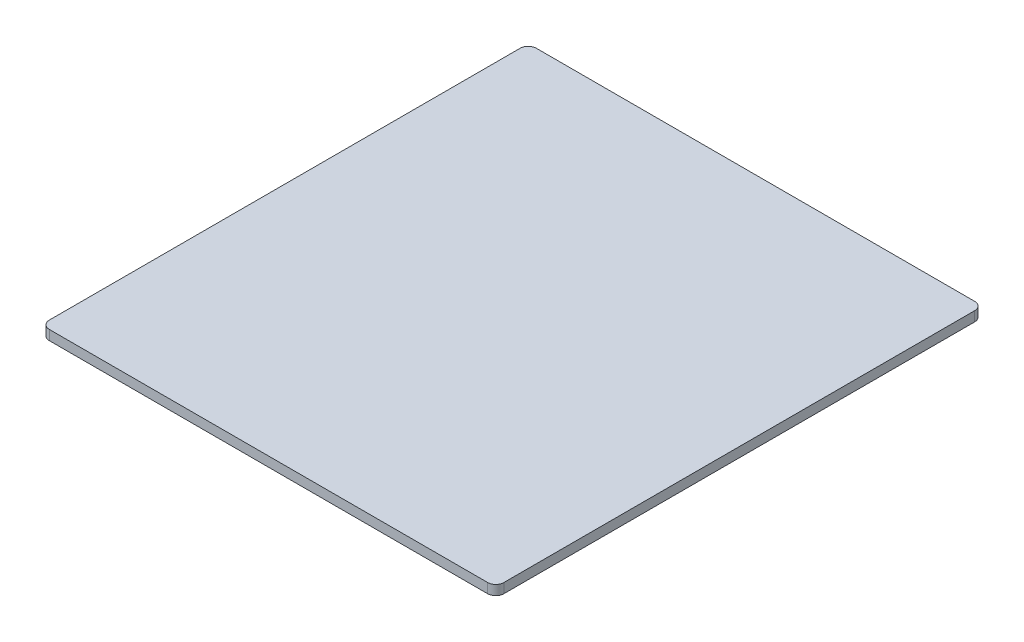
ISO-10303-21;
HEADER;
FILE_DESCRIPTION(('STEP AP214'),'2;1');
FILE_NAME('part.step','',(''),(''),'','','');
FILE_SCHEMA(('AUTOMOTIVE_DESIGN { 1 0 10303 214 1 1 1 1 }'));
ENDSEC;
DATA;
#1=APPLICATION_CONTEXT('core data for automotive mechanical design processes');
#2=APPLICATION_PROTOCOL_DEFINITION('international standard','automotive_design',2000,#1);
#3=PRODUCT_CONTEXT('',#1,'mechanical');
#4=PRODUCT('Part','Part','',(#3));
#5=PRODUCT_RELATED_PRODUCT_CATEGORY('part','',(#4));
#6=PRODUCT_DEFINITION_FORMATION('','',#4);
#7=PRODUCT_DEFINITION_CONTEXT('part definition',#1,'design');
#8=PRODUCT_DEFINITION('design','',#6,#7);
#9=PRODUCT_DEFINITION_SHAPE('','',#8);
#10=(LENGTH_UNIT() NAMED_UNIT(*) SI_UNIT(.MILLI.,.METRE.));
#11=(NAMED_UNIT(*) PLANE_ANGLE_UNIT() SI_UNIT($,.RADIAN.));
#12=(NAMED_UNIT(*) SI_UNIT($,.STERADIAN.) SOLID_ANGLE_UNIT());
#13=UNCERTAINTY_MEASURE_WITH_UNIT(LENGTH_MEASURE(1.E-05),#10,'distance_accuracy_value','');
#14=(GEOMETRIC_REPRESENTATION_CONTEXT(3) GLOBAL_UNCERTAINTY_ASSIGNED_CONTEXT((#13)) GLOBAL_UNIT_ASSIGNED_CONTEXT((#10,
#11,#12)) REPRESENTATION_CONTEXT('',''));
#15=CARTESIAN_POINT('',(0.,0.,0.));
#16=DIRECTION('',(0.,0.,1.));
#17=DIRECTION('',(1.,0.,0.));
#18=AXIS2_PLACEMENT_3D('',#15,#16,#17);
#19=CARTESIAN_POINT('',(140.,6.,150.));
#20=DIRECTION('',(-1.,0.,0.));
#21=DIRECTION('',(0.,0.,1.));
#22=AXIS2_PLACEMENT_3D('',#19,#20,#21);
#23=PLANE('',#22);
#24=DIRECTION('',(0.,0.,-1.));
#25=VECTOR('',#24,1.);
#26=CARTESIAN_POINT('',(140.,0.,150.));
#27=LINE('',#26,#25);
#28=CARTESIAN_POINT('',(140.,0.,145.));
#29=VERTEX_POINT('',#28);
#30=CARTESIAN_POINT('',(140.,0.,-145.));
#31=VERTEX_POINT('',#30);
#32=EDGE_CURVE('E134',#29,#31,#27,.T.);
#33=ORIENTED_EDGE('',*,*,#32,.T.);
#34=DIRECTION('',(0.,-1.,0.));
#35=VECTOR('',#34,1.);
#36=CARTESIAN_POINT('',(140.,6.,-145.));
#37=LINE('',#36,#35);
#38=CARTESIAN_POINT('',(140.,6.,-145.));
#39=VERTEX_POINT('',#38);
#40=EDGE_CURVE('E156',#31,#39,#37,.F.);
#41=ORIENTED_EDGE('',*,*,#40,.T.);
#42=DIRECTION('',(0.,0.,-1.));
#43=VECTOR('',#42,1.);
#44=CARTESIAN_POINT('',(140.,6.,150.));
#45=LINE('',#44,#43);
#46=CARTESIAN_POINT('',(140.,6.,145.));
#47=VERTEX_POINT('',#46);
#48=EDGE_CURVE('E132',#47,#39,#45,.T.);
#49=ORIENTED_EDGE('',*,*,#48,.F.);
#50=DIRECTION('',(0.,-1.,0.));
#51=VECTOR('',#50,1.);
#52=CARTESIAN_POINT('',(140.,6.,145.));
#53=LINE('',#52,#51);
#54=EDGE_CURVE('E153',#47,#29,#53,.T.);
#55=ORIENTED_EDGE('',*,*,#54,.T.);
#56=EDGE_LOOP('',(#33,#41,#49,#55));
#57=FACE_BOUND('',#56,.T.);
#58=ADVANCED_FACE('F37',(#57),#23,.F.);
#59=CARTESIAN_POINT('',(-140.,6.,-150.));
#60=DIRECTION('',(0.,0.,1.));
#61=DIRECTION('',(1.,0.,0.));
#62=AXIS2_PLACEMENT_3D('',#59,#60,#61);
#63=PLANE('',#62);
#64=DIRECTION('',(-1.,0.,0.));
#65=VECTOR('',#64,1.);
#66=CARTESIAN_POINT('',(-140.,0.,-150.));
#67=LINE('',#66,#65);
#68=CARTESIAN_POINT('',(135.,0.,-150.));
#69=VERTEX_POINT('',#68);
#70=CARTESIAN_POINT('',(-135.,0.,-150.));
#71=VERTEX_POINT('',#70);
#72=EDGE_CURVE('E130',#69,#71,#67,.T.);
#73=ORIENTED_EDGE('',*,*,#72,.T.);
#74=DIRECTION('',(0.,-1.,0.));
#75=VECTOR('',#74,1.);
#76=CARTESIAN_POINT('',(-135.,6.,-150.));
#77=LINE('',#76,#75);
#78=CARTESIAN_POINT('',(-135.,6.,-150.));
#79=VERTEX_POINT('',#78);
#80=EDGE_CURVE('E108',#71,#79,#77,.F.);
#81=ORIENTED_EDGE('',*,*,#80,.T.);
#82=DIRECTION('',(-1.,0.,0.));
#83=VECTOR('',#82,1.);
#84=CARTESIAN_POINT('',(-140.,6.,-150.));
#85=LINE('',#84,#83);
#86=CARTESIAN_POINT('',(135.,6.,-150.));
#87=VERTEX_POINT('',#86);
#88=EDGE_CURVE('E170',#87,#79,#85,.T.);
#89=ORIENTED_EDGE('',*,*,#88,.F.);
#90=DIRECTION('',(0.,-1.,0.));
#91=VECTOR('',#90,1.);
#92=CARTESIAN_POINT('',(135.,6.,-150.));
#93=LINE('',#92,#91);
#94=EDGE_CURVE('E113',#87,#69,#93,.T.);
#95=ORIENTED_EDGE('',*,*,#94,.T.);
#96=EDGE_LOOP('',(#73,#81,#89,#95));
#97=FACE_BOUND('',#96,.T.);
#98=ADVANCED_FACE('F175',(#97),#63,.F.);
#99=CARTESIAN_POINT('',(-140.,6.,150.));
#100=DIRECTION('',(1.,0.,0.));
#101=DIRECTION('',(0.,0.,-1.));
#102=AXIS2_PLACEMENT_3D('',#99,#100,#101);
#103=PLANE('',#102);
#104=DIRECTION('',(0.,0.,1.));
#105=VECTOR('',#104,1.);
#106=CARTESIAN_POINT('',(-140.,6.,150.));
#107=LINE('',#106,#105);
#108=CARTESIAN_POINT('',(-140.,6.,-145.));
#109=VERTEX_POINT('',#108);
#110=CARTESIAN_POINT('',(-140.,6.,145.));
#111=VERTEX_POINT('',#110);
#112=EDGE_CURVE('E122',#109,#111,#107,.T.);
#113=ORIENTED_EDGE('',*,*,#112,.F.);
#114=DIRECTION('',(0.,-1.,0.));
#115=VECTOR('',#114,1.);
#116=CARTESIAN_POINT('',(-140.,6.,-145.));
#117=LINE('',#116,#115);
#118=CARTESIAN_POINT('',(-140.,0.,-145.));
#119=VERTEX_POINT('',#118);
#120=EDGE_CURVE('E107',#109,#119,#117,.T.);
#121=ORIENTED_EDGE('',*,*,#120,.T.);
#122=DIRECTION('',(0.,0.,1.));
#123=VECTOR('',#122,1.);
#124=CARTESIAN_POINT('',(-140.,0.,150.));
#125=LINE('',#124,#123);
#126=CARTESIAN_POINT('',(-140.,0.,145.));
#127=VERTEX_POINT('',#126);
#128=EDGE_CURVE('E120',#119,#127,#125,.T.);
#129=ORIENTED_EDGE('',*,*,#128,.T.);
#130=DIRECTION('',(0.,-1.,0.));
#131=VECTOR('',#130,1.);
#132=CARTESIAN_POINT('',(-140.,6.,145.));
#133=LINE('',#132,#131);
#134=EDGE_CURVE('E124',#127,#111,#133,.F.);
#135=ORIENTED_EDGE('',*,*,#134,.T.);
#136=EDGE_LOOP('',(#113,#121,#129,#135));
#137=FACE_BOUND('',#136,.T.);
#138=ADVANCED_FACE('F119',(#137),#103,.F.);
#139=CARTESIAN_POINT('',(-140.,6.,150.));
#140=DIRECTION('',(0.,0.,-1.));
#141=DIRECTION('',(-1.,0.,0.));
#142=AXIS2_PLACEMENT_3D('',#139,#140,#141);
#143=PLANE('',#142);
#144=DIRECTION('',(1.,0.,0.));
#145=VECTOR('',#144,1.);
#146=CARTESIAN_POINT('',(-140.,6.,150.));
#147=LINE('',#146,#145);
#148=CARTESIAN_POINT('',(-135.,6.,150.));
#149=VERTEX_POINT('',#148);
#150=CARTESIAN_POINT('',(135.,6.,150.));
#151=VERTEX_POINT('',#150);
#152=EDGE_CURVE('E138',#149,#151,#147,.T.);
#153=ORIENTED_EDGE('',*,*,#152,.F.);
#154=DIRECTION('',(0.,-1.,0.));
#155=VECTOR('',#154,1.);
#156=CARTESIAN_POINT('',(-135.,6.,150.));
#157=LINE('',#156,#155);
#158=CARTESIAN_POINT('',(-135.,0.,150.));
#159=VERTEX_POINT('',#158);
#160=EDGE_CURVE('E11',#149,#159,#157,.T.);
#161=ORIENTED_EDGE('',*,*,#160,.T.);
#162=DIRECTION('',(1.,0.,0.));
#163=VECTOR('',#162,1.);
#164=CARTESIAN_POINT('',(-140.,0.,150.));
#165=LINE('',#164,#163);
#166=CARTESIAN_POINT('',(135.,0.,150.));
#167=VERTEX_POINT('',#166);
#168=EDGE_CURVE('E129',#159,#167,#165,.T.);
#169=ORIENTED_EDGE('',*,*,#168,.T.);
#170=DIRECTION('',(0.,-1.,0.));
#171=VECTOR('',#170,1.);
#172=CARTESIAN_POINT('',(135.,6.,150.));
#173=LINE('',#172,#171);
#174=EDGE_CURVE('E45',#167,#151,#173,.F.);
#175=ORIENTED_EDGE('',*,*,#174,.T.);
#176=EDGE_LOOP('',(#153,#161,#169,#175));
#177=FACE_BOUND('',#176,.T.);
#178=ADVANCED_FACE('F276',(#177),#143,.F.);
#179=CARTESIAN_POINT('',(0.,6.,0.));
#180=DIRECTION('',(0.,-1.,0.));
#181=DIRECTION('',(0.,0.,-1.));
#182=AXIS2_PLACEMENT_3D('',#179,#180,#181);
#183=PLANE('',#182);
#184=ORIENTED_EDGE('',*,*,#88,.T.);
#185=CARTESIAN_POINT('',(-135.,6.,-145.));
#186=DIRECTION('',(0.,-1.,0.));
#187=DIRECTION('',(0.,0.,-1.));
#188=AXIS2_PLACEMENT_3D('',#185,#186,#187);
#189=CIRCLE('',#188,5.);
#190=EDGE_CURVE('E151',#79,#109,#189,.F.);
#191=ORIENTED_EDGE('',*,*,#190,.T.);
#192=ORIENTED_EDGE('',*,*,#112,.T.);
#193=CARTESIAN_POINT('',(-135.,6.,145.));
#194=DIRECTION('',(0.,-1.,0.));
#195=DIRECTION('',(0.,0.,-1.));
#196=AXIS2_PLACEMENT_3D('',#193,#194,#195);
#197=CIRCLE('',#196,5.);
#198=EDGE_CURVE('E58',#111,#149,#197,.F.);
#199=ORIENTED_EDGE('',*,*,#198,.T.);
#200=ORIENTED_EDGE('',*,*,#152,.T.);
#201=CARTESIAN_POINT('',(135.,6.,145.));
#202=DIRECTION('',(0.,-1.,0.));
#203=DIRECTION('',(0.,0.,-1.));
#204=AXIS2_PLACEMENT_3D('',#201,#202,#203);
#205=CIRCLE('',#204,5.);
#206=EDGE_CURVE('E146',#151,#47,#205,.F.);
#207=ORIENTED_EDGE('',*,*,#206,.T.);
#208=ORIENTED_EDGE('',*,*,#48,.T.);
#209=CARTESIAN_POINT('',(135.,6.,-145.));
#210=DIRECTION('',(0.,-1.,0.));
#211=DIRECTION('',(0.,0.,-1.));
#212=AXIS2_PLACEMENT_3D('',#209,#210,#211);
#213=CIRCLE('',#212,5.);
#214=EDGE_CURVE('E149',#39,#87,#213,.F.);
#215=ORIENTED_EDGE('',*,*,#214,.T.);
#216=EDGE_LOOP('',(#184,#191,#192,#199,#200,#207,#208,#215));
#217=FACE_BOUND('',#216,.T.);
#218=ADVANCED_FACE('F167',(#217),#183,.F.);
#219=CARTESIAN_POINT('',(0.,0.,0.));
#220=DIRECTION('',(0.,-1.,0.));
#221=DIRECTION('',(0.,0.,-1.));
#222=AXIS2_PLACEMENT_3D('',#219,#220,#221);
#223=PLANE('',#222);
#224=CARTESIAN_POINT('',(-103.5,0.,-87.0000000000001));
#225=DIRECTION('',(0.,-1.,0.));
#226=DIRECTION('',(0.,0.,-1.));
#227=AXIS2_PLACEMENT_3D('',#224,#225,#226);
#228=CIRCLE('',#227,2.99999999999998);
#229=CARTESIAN_POINT('',(-103.5,0.,-90.0000000000001));
#230=VERTEX_POINT('',#229);
#231=EDGE_CURVE('E212',#230,#230,#228,.T.);
#232=ORIENTED_EDGE('',*,*,#231,.F.);
#233=EDGE_LOOP('',(#232));
#234=FACE_BOUND('',#233,.T.);
#235=CARTESIAN_POINT('',(105.5,0.,-73.0000000000001));
#236=DIRECTION('',(0.,-1.,0.));
#237=DIRECTION('',(0.,0.,-1.));
#238=AXIS2_PLACEMENT_3D('',#235,#236,#237);
#239=CIRCLE('',#238,3.00000000000001);
#240=CARTESIAN_POINT('',(105.5,0.,-76.0000000000001));
#241=VERTEX_POINT('',#240);
#242=EDGE_CURVE('E205',#241,#241,#239,.T.);
#243=ORIENTED_EDGE('',*,*,#242,.F.);
#244=EDGE_LOOP('',(#243));
#245=FACE_BOUND('',#244,.T.);
#246=CARTESIAN_POINT('',(105.5,0.,-87.0000000000001));
#247=DIRECTION('',(0.,-1.,0.));
#248=DIRECTION('',(0.,0.,-1.));
#249=AXIS2_PLACEMENT_3D('',#246,#247,#248);
#250=CIRCLE('',#249,2.99999999999999);
#251=CARTESIAN_POINT('',(105.5,0.,-90.0000000000001));
#252=VERTEX_POINT('',#251);
#253=EDGE_CURVE('E217',#252,#252,#250,.T.);
#254=ORIENTED_EDGE('',*,*,#253,.F.);
#255=EDGE_LOOP('',(#254));
#256=FACE_BOUND('',#255,.T.);
#257=CARTESIAN_POINT('',(-103.5,0.,-73.0000000000001));
#258=DIRECTION('',(0.,-1.,0.));
#259=DIRECTION('',(0.,0.,-1.));
#260=AXIS2_PLACEMENT_3D('',#257,#258,#259);
#261=CIRCLE('',#260,3.00000000000001);
#262=CARTESIAN_POINT('',(-103.5,0.,-76.0000000000002));
#263=VERTEX_POINT('',#262);
#264=EDGE_CURVE('E199',#263,#263,#261,.T.);
#265=ORIENTED_EDGE('',*,*,#264,.F.);
#266=EDGE_LOOP('',(#265));
#267=FACE_BOUND('',#266,.T.);
#268=CARTESIAN_POINT('',(-35.0734943823192,0.,-136.883397034053));
#269=DIRECTION('',(0.,-1.,0.));
#270=DIRECTION('',(0.,0.,-1.));
#271=AXIS2_PLACEMENT_3D('',#268,#269,#270);
#272=CIRCLE('',#271,3.);
#273=CARTESIAN_POINT('',(-35.0734943823192,0.,-139.883397034053));
#274=VERTEX_POINT('',#273);
#275=EDGE_CURVE('E187',#274,#274,#272,.T.);
#276=ORIENTED_EDGE('',*,*,#275,.F.);
#277=EDGE_LOOP('',(#276));
#278=FACE_BOUND('',#277,.T.);
#279=CARTESIAN_POINT('',(35.0000000000018,0.,-136.883397034053));
#280=DIRECTION('',(0.,-1.,0.));
#281=DIRECTION('',(0.,0.,-1.));
#282=AXIS2_PLACEMENT_3D('',#279,#280,#281);
#283=CIRCLE('',#282,2.9999999999985);
#284=CARTESIAN_POINT('',(35.0000000000018,0.,-139.883397034051));
#285=VERTEX_POINT('',#284);
#286=EDGE_CURVE('E194',#285,#285,#283,.T.);
#287=ORIENTED_EDGE('',*,*,#286,.F.);
#288=EDGE_LOOP('',(#287));
#289=FACE_BOUND('',#288,.T.);
#290=CARTESIAN_POINT('',(1.7706020975566E-12,0.,-136.883397034053));
#291=DIRECTION('',(0.,-1.,0.));
#292=DIRECTION('',(0.,0.,-1.));
#293=AXIS2_PLACEMENT_3D('',#290,#291,#292);
#294=CIRCLE('',#293,2.99999999999849);
#295=CARTESIAN_POINT('',(1.7706020975566E-12,0.,-139.883397034051));
#296=VERTEX_POINT('',#295);
#297=EDGE_CURVE('E178',#296,#296,#294,.T.);
#298=ORIENTED_EDGE('',*,*,#297,.F.);
#299=EDGE_LOOP('',(#298));
#300=FACE_BOUND('',#299,.T.);
#301=ORIENTED_EDGE('',*,*,#128,.F.);
#302=CARTESIAN_POINT('',(-135.,0.,-145.));
#303=DIRECTION('',(0.,-1.,0.));
#304=DIRECTION('',(0.,0.,-1.));
#305=AXIS2_PLACEMENT_3D('',#302,#303,#304);
#306=CIRCLE('',#305,5.);
#307=EDGE_CURVE('E103',#119,#71,#306,.T.);
#308=ORIENTED_EDGE('',*,*,#307,.T.);
#309=ORIENTED_EDGE('',*,*,#72,.F.);
#310=CARTESIAN_POINT('',(135.,0.,-145.));
#311=DIRECTION('',(0.,-1.,0.));
#312=DIRECTION('',(0.,0.,-1.));
#313=AXIS2_PLACEMENT_3D('',#310,#311,#312);
#314=CIRCLE('',#313,5.);
#315=EDGE_CURVE('E114',#69,#31,#314,.T.);
#316=ORIENTED_EDGE('',*,*,#315,.T.);
#317=ORIENTED_EDGE('',*,*,#32,.F.);
#318=CARTESIAN_POINT('',(135.,0.,145.));
#319=DIRECTION('',(0.,-1.,0.));
#320=DIRECTION('',(0.,0.,-1.));
#321=AXIS2_PLACEMENT_3D('',#318,#319,#320);
#322=CIRCLE('',#321,5.);
#323=EDGE_CURVE('E123',#29,#167,#322,.T.);
#324=ORIENTED_EDGE('',*,*,#323,.T.);
#325=ORIENTED_EDGE('',*,*,#168,.F.);
#326=CARTESIAN_POINT('',(-135.,0.,145.));
#327=DIRECTION('',(0.,-1.,0.));
#328=DIRECTION('',(0.,0.,-1.));
#329=AXIS2_PLACEMENT_3D('',#326,#327,#328);
#330=CIRCLE('',#329,5.);
#331=EDGE_CURVE('E128',#159,#127,#330,.T.);
#332=ORIENTED_EDGE('',*,*,#331,.T.);
#333=EDGE_LOOP('',(#301,#308,#309,#316,#317,#324,#325,#332));
#334=FACE_BOUND('',#333,.T.);
#335=ADVANCED_FACE('F126',(#234,#245,#256,#267,#278,#289,#300,#334),#223,.T.);
#336=CARTESIAN_POINT('',(-135.,6.,-145.));
#337=DIRECTION('',(0.,-1.,0.));
#338=DIRECTION('',(0.,0.,-1.));
#339=AXIS2_PLACEMENT_3D('',#336,#337,#338);
#340=CYLINDRICAL_SURFACE('',#339,5.);
#341=ORIENTED_EDGE('',*,*,#190,.F.);
#342=ORIENTED_EDGE('',*,*,#80,.F.);
#343=ORIENTED_EDGE('',*,*,#307,.F.);
#344=ORIENTED_EDGE('',*,*,#120,.F.);
#345=EDGE_LOOP('',(#341,#342,#343,#344));
#346=FACE_BOUND('',#345,.T.);
#347=ADVANCED_FACE('F106',(#346),#340,.T.);
#348=CARTESIAN_POINT('',(135.,6.,-145.));
#349=DIRECTION('',(0.,-1.,0.));
#350=DIRECTION('',(0.,0.,-1.));
#351=AXIS2_PLACEMENT_3D('',#348,#349,#350);
#352=CYLINDRICAL_SURFACE('',#351,5.);
#353=ORIENTED_EDGE('',*,*,#214,.F.);
#354=ORIENTED_EDGE('',*,*,#40,.F.);
#355=ORIENTED_EDGE('',*,*,#315,.F.);
#356=ORIENTED_EDGE('',*,*,#94,.F.);
#357=EDGE_LOOP('',(#353,#354,#355,#356));
#358=FACE_BOUND('',#357,.T.);
#359=ADVANCED_FACE('F173',(#358),#352,.T.);
#360=CARTESIAN_POINT('',(-135.,6.,145.));
#361=DIRECTION('',(0.,-1.,0.));
#362=DIRECTION('',(0.,0.,-1.));
#363=AXIS2_PLACEMENT_3D('',#360,#361,#362);
#364=CYLINDRICAL_SURFACE('',#363,5.);
#365=ORIENTED_EDGE('',*,*,#198,.F.);
#366=ORIENTED_EDGE('',*,*,#134,.F.);
#367=ORIENTED_EDGE('',*,*,#331,.F.);
#368=ORIENTED_EDGE('',*,*,#160,.F.);
#369=EDGE_LOOP('',(#365,#366,#367,#368));
#370=FACE_BOUND('',#369,.T.);
#371=ADVANCED_FACE('F256',(#370),#364,.T.);
#372=CARTESIAN_POINT('',(135.,6.,145.));
#373=DIRECTION('',(0.,-1.,0.));
#374=DIRECTION('',(0.,0.,-1.));
#375=AXIS2_PLACEMENT_3D('',#372,#373,#374);
#376=CYLINDRICAL_SURFACE('',#375,5.);
#377=ORIENTED_EDGE('',*,*,#206,.F.);
#378=ORIENTED_EDGE('',*,*,#174,.F.);
#379=ORIENTED_EDGE('',*,*,#323,.F.);
#380=ORIENTED_EDGE('',*,*,#54,.F.);
#381=EDGE_LOOP('',(#377,#378,#379,#380));
#382=FACE_BOUND('',#381,.T.);
#383=ADVANCED_FACE('F39',(#382),#376,.T.);
#384=CARTESIAN_POINT('',(1.7706020975566E-12,5.,-136.883397034053));
#385=DIRECTION('',(0.,-1.,0.));
#386=DIRECTION('',(0.,0.,-1.));
#387=AXIS2_PLACEMENT_3D('',#384,#385,#386);
#388=CYLINDRICAL_SURFACE('',#387,2.99999999999849);
#389=CARTESIAN_POINT('',(1.7706020975566E-12,5.,-136.883397034053));
#390=DIRECTION('',(0.,-1.,0.));
#391=DIRECTION('',(0.,0.,-1.));
#392=AXIS2_PLACEMENT_3D('',#389,#390,#391);
#393=CIRCLE('',#392,2.99999999999849);
#394=CARTESIAN_POINT('',(1.7706020975566E-12,5.,-139.883397034051));
#395=VERTEX_POINT('',#394);
#396=EDGE_CURVE('E176',#395,#395,#393,.T.);
#397=ORIENTED_EDGE('',*,*,#396,.F.);
#398=EDGE_LOOP('',(#397));
#399=FACE_BOUND('',#398,.T.);
#400=ORIENTED_EDGE('',*,*,#297,.T.);
#401=EDGE_LOOP('',(#400));
#402=FACE_BOUND('',#401,.T.);
#403=ADVANCED_FACE('F244',(#399,#402),#388,.F.);
#404=CARTESIAN_POINT('',(1.7706020975566E-12,5.,-136.883397034053));
#405=DIRECTION('',(0.,-1.,0.));
#406=DIRECTION('',(0.,0.,-1.));
#407=AXIS2_PLACEMENT_3D('',#404,#405,#406);
#408=PLANE('',#407);
#409=ORIENTED_EDGE('',*,*,#396,.T.);
#410=EDGE_LOOP('',(#409));
#411=FACE_BOUND('',#410,.T.);
#412=ADVANCED_FACE('F246',(#411),#408,.T.);
#413=CARTESIAN_POINT('',(35.0000000000018,5.,-136.883397034053));
#414=DIRECTION('',(0.,-1.,0.));
#415=DIRECTION('',(0.,0.,-1.));
#416=AXIS2_PLACEMENT_3D('',#413,#414,#415);
#417=CYLINDRICAL_SURFACE('',#416,2.9999999999985);
#418=CARTESIAN_POINT('',(35.0000000000018,5.,-136.883397034053));
#419=DIRECTION('',(0.,-1.,0.));
#420=DIRECTION('',(0.,0.,-1.));
#421=AXIS2_PLACEMENT_3D('',#418,#419,#420);
#422=CIRCLE('',#421,2.9999999999985);
#423=CARTESIAN_POINT('',(35.0000000000018,5.,-139.883397034051));
#424=VERTEX_POINT('',#423);
#425=EDGE_CURVE('E185',#424,#424,#422,.T.);
#426=ORIENTED_EDGE('',*,*,#425,.F.);
#427=EDGE_LOOP('',(#426));
#428=FACE_BOUND('',#427,.T.);
#429=ORIENTED_EDGE('',*,*,#286,.T.);
#430=EDGE_LOOP('',(#429));
#431=FACE_BOUND('',#430,.T.);
#432=ADVANCED_FACE('F253',(#428,#431),#417,.F.);
#433=CARTESIAN_POINT('',(35.0000000000018,5.,-136.883397034053));
#434=DIRECTION('',(0.,-1.,0.));
#435=DIRECTION('',(0.,0.,-1.));
#436=AXIS2_PLACEMENT_3D('',#433,#434,#435);
#437=PLANE('',#436);
#438=ORIENTED_EDGE('',*,*,#425,.T.);
#439=EDGE_LOOP('',(#438));
#440=FACE_BOUND('',#439,.T.);
#441=ADVANCED_FACE('F351',(#440),#437,.T.);
#442=CARTESIAN_POINT('',(-35.0734943823192,5.,-136.883397034053));
#443=DIRECTION('',(0.,-1.,0.));
#444=DIRECTION('',(0.,0.,-1.));
#445=AXIS2_PLACEMENT_3D('',#442,#443,#444);
#446=CYLINDRICAL_SURFACE('',#445,3.);
#447=CARTESIAN_POINT('',(-35.0734943823192,5.,-136.883397034053));
#448=DIRECTION('',(0.,-1.,0.));
#449=DIRECTION('',(0.,0.,-1.));
#450=AXIS2_PLACEMENT_3D('',#447,#448,#449);
#451=CIRCLE('',#450,3.);
#452=CARTESIAN_POINT('',(-35.0734943823192,5.,-139.883397034053));
#453=VERTEX_POINT('',#452);
#454=EDGE_CURVE('E190',#453,#453,#451,.T.);
#455=ORIENTED_EDGE('',*,*,#454,.F.);
#456=EDGE_LOOP('',(#455));
#457=FACE_BOUND('',#456,.T.);
#458=ORIENTED_EDGE('',*,*,#275,.T.);
#459=EDGE_LOOP('',(#458));
#460=FACE_BOUND('',#459,.T.);
#461=ADVANCED_FACE('F361',(#457,#460),#446,.F.);
#462=CARTESIAN_POINT('',(-35.0734943823192,5.,-136.883397034053));
#463=DIRECTION('',(0.,-1.,0.));
#464=DIRECTION('',(0.,0.,-1.));
#465=AXIS2_PLACEMENT_3D('',#462,#463,#464);
#466=PLANE('',#465);
#467=ORIENTED_EDGE('',*,*,#454,.T.);
#468=EDGE_LOOP('',(#467));
#469=FACE_BOUND('',#468,.T.);
#470=ADVANCED_FACE('F370',(#469),#466,.T.);
#471=CARTESIAN_POINT('',(-103.5,5.,-73.0000000000001));
#472=DIRECTION('',(0.,-1.,0.));
#473=DIRECTION('',(0.,0.,-1.));
#474=AXIS2_PLACEMENT_3D('',#471,#472,#473);
#475=CYLINDRICAL_SURFACE('',#474,3.00000000000001);
#476=CARTESIAN_POINT('',(-103.5,5.,-73.0000000000001));
#477=DIRECTION('',(0.,-1.,0.));
#478=DIRECTION('',(0.,0.,-1.));
#479=AXIS2_PLACEMENT_3D('',#476,#477,#478);
#480=CIRCLE('',#479,3.00000000000001);
#481=CARTESIAN_POINT('',(-103.5,5.,-76.0000000000002));
#482=VERTEX_POINT('',#481);
#483=EDGE_CURVE('E191',#482,#482,#480,.T.);
#484=ORIENTED_EDGE('',*,*,#483,.F.);
#485=EDGE_LOOP('',(#484));
#486=FACE_BOUND('',#485,.T.);
#487=ORIENTED_EDGE('',*,*,#264,.T.);
#488=EDGE_LOOP('',(#487));
#489=FACE_BOUND('',#488,.T.);
#490=ADVANCED_FACE('F379',(#486,#489),#475,.F.);
#491=CARTESIAN_POINT('',(-103.5,5.,-73.0000000000001));
#492=DIRECTION('',(0.,-1.,0.));
#493=DIRECTION('',(0.,0.,-1.));
#494=AXIS2_PLACEMENT_3D('',#491,#492,#493);
#495=PLANE('',#494);
#496=ORIENTED_EDGE('',*,*,#483,.T.);
#497=EDGE_LOOP('',(#496));
#498=FACE_BOUND('',#497,.T.);
#499=ADVANCED_FACE('F228',(#498),#495,.T.);
#500=CARTESIAN_POINT('',(105.5,5.,-87.0000000000001));
#501=DIRECTION('',(0.,-1.,0.));
#502=DIRECTION('',(0.,0.,-1.));
#503=AXIS2_PLACEMENT_3D('',#500,#501,#502);
#504=CYLINDRICAL_SURFACE('',#503,2.99999999999999);
#505=CARTESIAN_POINT('',(105.5,5.,-87.0000000000001));
#506=DIRECTION('',(0.,-1.,0.));
#507=DIRECTION('',(0.,0.,-1.));
#508=AXIS2_PLACEMENT_3D('',#505,#506,#507);
#509=CIRCLE('',#508,2.99999999999999);
#510=CARTESIAN_POINT('',(105.5,5.,-90.0000000000001));
#511=VERTEX_POINT('',#510);
#512=EDGE_CURVE('E209',#511,#511,#509,.T.);
#513=ORIENTED_EDGE('',*,*,#512,.F.);
#514=EDGE_LOOP('',(#513));
#515=FACE_BOUND('',#514,.T.);
#516=ORIENTED_EDGE('',*,*,#253,.T.);
#517=EDGE_LOOP('',(#516));
#518=FACE_BOUND('',#517,.T.);
#519=ADVANCED_FACE('F225',(#515,#518),#504,.F.);
#520=CARTESIAN_POINT('',(105.5,5.,-87.0000000000001));
#521=DIRECTION('',(0.,-1.,0.));
#522=DIRECTION('',(0.,0.,-1.));
#523=AXIS2_PLACEMENT_3D('',#520,#521,#522);
#524=PLANE('',#523);
#525=ORIENTED_EDGE('',*,*,#512,.T.);
#526=EDGE_LOOP('',(#525));
#527=FACE_BOUND('',#526,.T.);
#528=ADVANCED_FACE('F223',(#527),#524,.T.);
#529=CARTESIAN_POINT('',(105.5,5.,-73.0000000000001));
#530=DIRECTION('',(0.,-1.,0.));
#531=DIRECTION('',(0.,0.,-1.));
#532=AXIS2_PLACEMENT_3D('',#529,#530,#531);
#533=CYLINDRICAL_SURFACE('',#532,3.00000000000001);
#534=CARTESIAN_POINT('',(105.5,5.,-73.0000000000001));
#535=DIRECTION('',(0.,-1.,0.));
#536=DIRECTION('',(0.,0.,-1.));
#537=AXIS2_PLACEMENT_3D('',#534,#535,#536);
#538=CIRCLE('',#537,3.00000000000001);
#539=CARTESIAN_POINT('',(105.5,5.,-76.0000000000001));
#540=VERTEX_POINT('',#539);
#541=EDGE_CURVE('E208',#540,#540,#538,.T.);
#542=ORIENTED_EDGE('',*,*,#541,.F.);
#543=EDGE_LOOP('',(#542));
#544=FACE_BOUND('',#543,.T.);
#545=ORIENTED_EDGE('',*,*,#242,.T.);
#546=EDGE_LOOP('',(#545));
#547=FACE_BOUND('',#546,.T.);
#548=ADVANCED_FACE('F410',(#544,#547),#533,.F.);
#549=CARTESIAN_POINT('',(105.5,5.,-73.0000000000001));
#550=DIRECTION('',(0.,-1.,0.));
#551=DIRECTION('',(0.,0.,-1.));
#552=AXIS2_PLACEMENT_3D('',#549,#550,#551);
#553=PLANE('',#552);
#554=ORIENTED_EDGE('',*,*,#541,.T.);
#555=EDGE_LOOP('',(#554));
#556=FACE_BOUND('',#555,.T.);
#557=ADVANCED_FACE('F418',(#556),#553,.T.);
#558=CARTESIAN_POINT('',(-103.5,5.,-87.0000000000001));
#559=DIRECTION('',(0.,-1.,0.));
#560=DIRECTION('',(0.,0.,-1.));
#561=AXIS2_PLACEMENT_3D('',#558,#559,#560);
#562=CYLINDRICAL_SURFACE('',#561,2.99999999999998);
#563=CARTESIAN_POINT('',(-103.5,5.,-87.0000000000001));
#564=DIRECTION('',(0.,-1.,0.));
#565=DIRECTION('',(0.,0.,-1.));
#566=AXIS2_PLACEMENT_3D('',#563,#564,#565);
#567=CIRCLE('',#566,2.99999999999998);
#568=CARTESIAN_POINT('',(-103.5,5.,-90.0000000000001));
#569=VERTEX_POINT('',#568);
#570=EDGE_CURVE('E202',#569,#569,#567,.T.);
#571=ORIENTED_EDGE('',*,*,#570,.F.);
#572=EDGE_LOOP('',(#571));
#573=FACE_BOUND('',#572,.T.);
#574=ORIENTED_EDGE('',*,*,#231,.T.);
#575=EDGE_LOOP('',(#574));
#576=FACE_BOUND('',#575,.T.);
#577=ADVANCED_FACE('F427',(#573,#576),#562,.F.);
#578=CARTESIAN_POINT('',(-103.5,5.,-87.0000000000001));
#579=DIRECTION('',(0.,-1.,0.));
#580=DIRECTION('',(0.,0.,-1.));
#581=AXIS2_PLACEMENT_3D('',#578,#579,#580);
#582=PLANE('',#581);
#583=ORIENTED_EDGE('',*,*,#570,.T.);
#584=EDGE_LOOP('',(#583));
#585=FACE_BOUND('',#584,.T.);
#586=ADVANCED_FACE('F436',(#585),#582,.T.);
#587=CLOSED_SHELL('',(#58,#98,#138,#178,#218,#335,#347,#359,#371,#383,#403,#412,#432,#441,#461,
#470,#490,#499,#519,#528,#548,#557,#577,#586));
#588=MANIFOLD_SOLID_BREP('B2',#587);
#589=ADVANCED_BREP_SHAPE_REPRESENTATION('',(#18,#588),#14);
#590=SHAPE_DEFINITION_REPRESENTATION(#9,#589);
ENDSEC;
END-ISO-10303-21;
